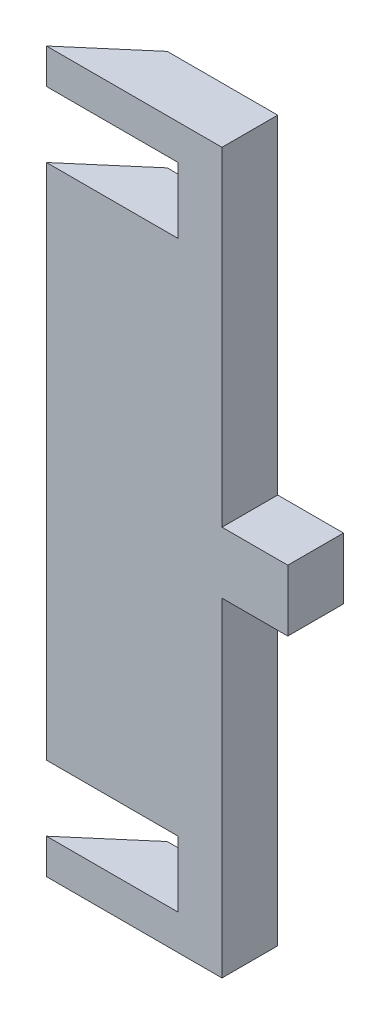
ISO-10303-21;
HEADER;
FILE_DESCRIPTION(('STEP AP214'),'2;1');
FILE_NAME('part.step','',(''),(''),'','','');
FILE_SCHEMA(('AUTOMOTIVE_DESIGN { 1 0 10303 214 1 1 1 1 }'));
ENDSEC;
DATA;
#1=APPLICATION_CONTEXT('core data for automotive mechanical design processes');
#2=APPLICATION_PROTOCOL_DEFINITION('international standard','automotive_design',2000,#1);
#3=PRODUCT_CONTEXT('',#1,'mechanical');
#4=PRODUCT('Part','Part','',(#3));
#5=PRODUCT_RELATED_PRODUCT_CATEGORY('part','',(#4));
#6=PRODUCT_DEFINITION_FORMATION('','',#4);
#7=PRODUCT_DEFINITION_CONTEXT('part definition',#1,'design');
#8=PRODUCT_DEFINITION('design','',#6,#7);
#9=PRODUCT_DEFINITION_SHAPE('','',#8);
#10=(LENGTH_UNIT() NAMED_UNIT(*) SI_UNIT(.MILLI.,.METRE.));
#11=(NAMED_UNIT(*) PLANE_ANGLE_UNIT() SI_UNIT($,.RADIAN.));
#12=(NAMED_UNIT(*) SI_UNIT($,.STERADIAN.) SOLID_ANGLE_UNIT());
#13=UNCERTAINTY_MEASURE_WITH_UNIT(LENGTH_MEASURE(1.E-05),#10,'distance_accuracy_value','');
#14=(GEOMETRIC_REPRESENTATION_CONTEXT(3) GLOBAL_UNCERTAINTY_ASSIGNED_CONTEXT((#13)) GLOBAL_UNIT_ASSIGNED_CONTEXT((#10,
#11,#12)) REPRESENTATION_CONTEXT('',''));
#15=CARTESIAN_POINT('',(0.,0.,0.));
#16=DIRECTION('',(0.,0.,1.));
#17=DIRECTION('',(1.,0.,0.));
#18=AXIS2_PLACEMENT_3D('',#15,#16,#17);
#19=CARTESIAN_POINT('',(60.,170.,0.));
#20=DIRECTION('',(0.,0.,-1.));
#21=DIRECTION('',(-1.,0.,0.));
#22=AXIS2_PLACEMENT_3D('',#19,#20,#21);
#23=PLANE('',#22);
#24=DIRECTION('',(-1.,0.,0.));
#25=VECTOR('',#24,1.);
#26=CARTESIAN_POINT('',(0.,81.,0.));
#27=LINE('',#26,#25);
#28=CARTESIAN_POINT('',(55.,81.,0.));
#29=VERTEX_POINT('',#28);
#30=CARTESIAN_POINT('',(40.,81.,0.));
#31=VERTEX_POINT('',#30);
#32=EDGE_CURVE('E237',#29,#31,#27,.T.);
#33=ORIENTED_EDGE('',*,*,#32,.F.);
#34=DIRECTION('',(0.,-1.,0.));
#35=VECTOR('',#34,1.);
#36=CARTESIAN_POINT('',(55.,95.,0.));
#37=LINE('',#36,#35);
#38=CARTESIAN_POINT('',(55.,95.,0.));
#39=VERTEX_POINT('',#38);
#40=EDGE_CURVE('E230',#39,#29,#37,.T.);
#41=ORIENTED_EDGE('',*,*,#40,.F.);
#42=DIRECTION('',(-1.,0.,0.));
#43=VECTOR('',#42,1.);
#44=CARTESIAN_POINT('',(0.,95.,0.));
#45=LINE('',#44,#43);
#46=CARTESIAN_POINT('',(40.,95.,0.));
#47=VERTEX_POINT('',#46);
#48=EDGE_CURVE('E212',#39,#47,#45,.T.);
#49=ORIENTED_EDGE('',*,*,#48,.T.);
#50=DIRECTION('',(0.,-1.,0.));
#51=VECTOR('',#50,1.);
#52=CARTESIAN_POINT('',(40.,0.,0.));
#53=LINE('',#52,#51);
#54=CARTESIAN_POINT('',(40.,170.,0.));
#55=VERTEX_POINT('',#54);
#56=EDGE_CURVE('E224',#55,#47,#53,.T.);
#57=ORIENTED_EDGE('',*,*,#56,.F.);
#58=DIRECTION('',(1.,0.,0.));
#59=VECTOR('',#58,1.);
#60=CARTESIAN_POINT('',(60.,170.,0.));
#61=LINE('',#60,#59);
#62=CARTESIAN_POINT('',(0.,170.,0.));
#63=VERTEX_POINT('',#62);
#64=EDGE_CURVE('E327',#63,#55,#61,.T.);
#65=ORIENTED_EDGE('',*,*,#64,.F.);
#66=DIRECTION('',(0.,-1.,0.));
#67=VECTOR('',#66,1.);
#68=CARTESIAN_POINT('',(0.,170.,0.));
#69=LINE('',#68,#67);
#70=CARTESIAN_POINT('',(0.,162.,0.));
#71=VERTEX_POINT('',#70);
#72=EDGE_CURVE('E336',#63,#71,#69,.T.);
#73=ORIENTED_EDGE('',*,*,#72,.T.);
#74=DIRECTION('',(1.,0.,0.));
#75=VECTOR('',#74,1.);
#76=CARTESIAN_POINT('',(0.,162.,0.));
#77=LINE('',#76,#75);
#78=CARTESIAN_POINT('',(30.,162.,0.));
#79=VERTEX_POINT('',#78);
#80=EDGE_CURVE('E252',#71,#79,#77,.T.);
#81=ORIENTED_EDGE('',*,*,#80,.T.);
#82=DIRECTION('',(0.,1.,0.));
#83=VECTOR('',#82,1.);
#84=CARTESIAN_POINT('',(30.,0.,0.));
#85=LINE('',#84,#83);
#86=CARTESIAN_POINT('',(30.,147.,0.));
#87=VERTEX_POINT('',#86);
#88=EDGE_CURVE('E245',#87,#79,#85,.T.);
#89=ORIENTED_EDGE('',*,*,#88,.F.);
#90=DIRECTION('',(1.,0.,0.));
#91=VECTOR('',#90,1.);
#92=CARTESIAN_POINT('',(0.,147.,0.));
#93=LINE('',#92,#91);
#94=CARTESIAN_POINT('',(0.,147.,0.));
#95=VERTEX_POINT('',#94);
#96=EDGE_CURVE('E249',#95,#87,#93,.T.);
#97=ORIENTED_EDGE('',*,*,#96,.F.);
#98=CARTESIAN_POINT('',(0.,29.,0.));
#99=VERTEX_POINT('',#98);
#100=EDGE_CURVE('E341',#95,#99,#69,.T.);
#101=ORIENTED_EDGE('',*,*,#100,.T.);
#102=DIRECTION('',(1.,0.,0.));
#103=VECTOR('',#102,1.);
#104=CARTESIAN_POINT('',(0.,29.,0.));
#105=LINE('',#104,#103);
#106=CARTESIAN_POINT('',(30.,29.,0.));
#107=VERTEX_POINT('',#106);
#108=EDGE_CURVE('E275',#99,#107,#105,.T.);
#109=ORIENTED_EDGE('',*,*,#108,.T.);
#110=DIRECTION('',(0.,1.,0.));
#111=VECTOR('',#110,1.);
#112=CARTESIAN_POINT('',(30.,0.,0.));
#113=LINE('',#112,#111);
#114=CARTESIAN_POINT('',(30.,14.,0.));
#115=VERTEX_POINT('',#114);
#116=EDGE_CURVE('E289',#115,#107,#113,.T.);
#117=ORIENTED_EDGE('',*,*,#116,.F.);
#118=DIRECTION('',(1.,0.,0.));
#119=VECTOR('',#118,1.);
#120=CARTESIAN_POINT('',(0.,14.,0.));
#121=LINE('',#120,#119);
#122=CARTESIAN_POINT('',(0.,14.,0.));
#123=VERTEX_POINT('',#122);
#124=EDGE_CURVE('E292',#123,#115,#121,.T.);
#125=ORIENTED_EDGE('',*,*,#124,.F.);
#126=CARTESIAN_POINT('',(0.,6.00000000000001,0.));
#127=VERTEX_POINT('',#126);
#128=EDGE_CURVE('E335',#123,#127,#69,.T.);
#129=ORIENTED_EDGE('',*,*,#128,.T.);
#130=DIRECTION('',(-1.,0.,0.));
#131=VECTOR('',#130,1.);
#132=CARTESIAN_POINT('',(0.,6.00000000000001,0.));
#133=LINE('',#132,#131);
#134=CARTESIAN_POINT('',(40.,6.00000000000001,0.));
#135=VERTEX_POINT('',#134);
#136=EDGE_CURVE('E262',#135,#127,#133,.T.);
#137=ORIENTED_EDGE('',*,*,#136,.F.);
#138=DIRECTION('',(0.,1.,0.));
#139=VECTOR('',#138,1.);
#140=CARTESIAN_POINT('',(40.,0.,0.));
#141=LINE('',#140,#139);
#142=EDGE_CURVE('E265',#135,#31,#141,.T.);
#143=ORIENTED_EDGE('',*,*,#142,.T.);
#144=EDGE_LOOP('',(#33,#41,#49,#57,#65,#73,#81,#89,#97,#101,#109,#117,#125,#129,#137,#143));
#145=FACE_BOUND('',#144,.T.);
#146=ADVANCED_FACE('F99',(#145),#23,.F.);
#147=CARTESIAN_POINT('',(0.,170.,0.));
#148=DIRECTION('',(0.650774217265847,0.,0.759271307334884));
#149=DIRECTION('',(0.759271307334884,0.,-0.650774217265847));
#150=AXIS2_PLACEMENT_3D('',#147,#148,#149);
#151=PLANE('',#150);
#152=DIRECTION('',(0.759271307334884,0.,-0.650774217265847));
#153=VECTOR('',#152,1.);
#154=CARTESIAN_POINT('',(0.,6.00000000000001,0.));
#155=LINE('',#154,#153);
#156=CARTESIAN_POINT('',(14.8173442452375,6.00000000000001,-12.7));
#157=VERTEX_POINT('',#156);
#158=EDGE_CURVE('E122',#127,#157,#155,.T.);
#159=ORIENTED_EDGE('',*,*,#158,.F.);
#160=ORIENTED_EDGE('',*,*,#128,.F.);
#161=DIRECTION('',(-0.759271307334884,0.,0.650774217265847));
#162=VECTOR('',#161,1.);
#163=CARTESIAN_POINT('',(0.,14.,0.));
#164=LINE('',#163,#162);
#165=CARTESIAN_POINT('',(14.8173442452375,14.,-12.7));
#166=VERTEX_POINT('',#165);
#167=EDGE_CURVE('E307',#166,#123,#164,.T.);
#168=ORIENTED_EDGE('',*,*,#167,.F.);
#169=DIRECTION('',(0.,-1.,0.));
#170=VECTOR('',#169,1.);
#171=CARTESIAN_POINT('',(14.8173442452375,170.,-12.7));
#172=LINE('',#171,#170);
#173=EDGE_CURVE('E322',#166,#157,#172,.T.);
#174=ORIENTED_EDGE('',*,*,#173,.T.);
#175=EDGE_LOOP('',(#159,#160,#168,#174));
#176=FACE_BOUND('',#175,.T.);
#177=ADVANCED_FACE('F420',(#176),#151,.F.);
#178=DIRECTION('',(-0.759271307334884,0.,0.650774217265847));
#179=VECTOR('',#178,1.);
#180=CARTESIAN_POINT('',(0.,147.,0.));
#181=LINE('',#180,#179);
#182=CARTESIAN_POINT('',(14.8173442452375,147.,-12.7));
#183=VERTEX_POINT('',#182);
#184=EDGE_CURVE('E310',#183,#95,#181,.T.);
#185=ORIENTED_EDGE('',*,*,#184,.F.);
#186=CARTESIAN_POINT('',(14.8173442452375,29.,-12.7));
#187=VERTEX_POINT('',#186);
#188=EDGE_CURVE('E328',#183,#187,#172,.T.);
#189=ORIENTED_EDGE('',*,*,#188,.T.);
#190=DIRECTION('',(-0.759271307334884,0.,0.650774217265847));
#191=VECTOR('',#190,1.);
#192=CARTESIAN_POINT('',(0.,29.,0.));
#193=LINE('',#192,#191);
#194=EDGE_CURVE('E300',#187,#99,#193,.T.);
#195=ORIENTED_EDGE('',*,*,#194,.T.);
#196=ORIENTED_EDGE('',*,*,#100,.F.);
#197=EDGE_LOOP('',(#185,#189,#195,#196));
#198=FACE_BOUND('',#197,.T.);
#199=ADVANCED_FACE('F409',(#198),#151,.F.);
#200=CARTESIAN_POINT('',(0.,170.,0.));
#201=DIRECTION('',(0.,1.,0.));
#202=DIRECTION('',(0.,0.,1.));
#203=AXIS2_PLACEMENT_3D('',#200,#201,#202);
#204=PLANE('',#203);
#205=ORIENTED_EDGE('',*,*,#64,.T.);
#206=DIRECTION('',(0.,0.,-1.));
#207=VECTOR('',#206,1.);
#208=CARTESIAN_POINT('',(40.,170.,0.));
#209=LINE('',#208,#207);
#210=CARTESIAN_POINT('',(40.,170.,-12.7));
#211=VERTEX_POINT('',#210);
#212=EDGE_CURVE('E223',#55,#211,#209,.T.);
#213=ORIENTED_EDGE('',*,*,#212,.T.);
#214=DIRECTION('',(-1.,0.,0.));
#215=VECTOR('',#214,1.);
#216=CARTESIAN_POINT('',(46.,170.,-12.7));
#217=LINE('',#216,#215);
#218=CARTESIAN_POINT('',(14.8173442452375,170.,-12.7));
#219=VERTEX_POINT('',#218);
#220=EDGE_CURVE('E319',#211,#219,#217,.T.);
#221=ORIENTED_EDGE('',*,*,#220,.T.);
#222=DIRECTION('',(-0.759271307334884,0.,0.650774217265847));
#223=VECTOR('',#222,1.);
#224=CARTESIAN_POINT('',(0.,170.,0.));
#225=LINE('',#224,#223);
#226=EDGE_CURVE('E332',#219,#63,#225,.T.);
#227=ORIENTED_EDGE('',*,*,#226,.T.);
#228=EDGE_LOOP('',(#205,#213,#221,#227));
#229=FACE_BOUND('',#228,.T.);
#230=ADVANCED_FACE('F388',(#229),#204,.T.);
#231=CARTESIAN_POINT('',(46.,170.,-12.7));
#232=DIRECTION('',(0.,0.,1.));
#233=DIRECTION('',(1.,0.,0.));
#234=AXIS2_PLACEMENT_3D('',#231,#232,#233);
#235=PLANE('',#234);
#236=DIRECTION('',(1.,0.,0.));
#237=VECTOR('',#236,1.);
#238=CARTESIAN_POINT('',(46.,81.,-12.7));
#239=LINE('',#238,#237);
#240=CARTESIAN_POINT('',(40.,81.,-12.7));
#241=VERTEX_POINT('',#240);
#242=CARTESIAN_POINT('',(55.,81.,-12.7));
#243=VERTEX_POINT('',#242);
#244=EDGE_CURVE('E12',#241,#243,#239,.T.);
#245=ORIENTED_EDGE('',*,*,#244,.F.);
#246=DIRECTION('',(0.,-1.,0.));
#247=VECTOR('',#246,1.);
#248=CARTESIAN_POINT('',(40.,170.,-12.7));
#249=LINE('',#248,#247);
#250=CARTESIAN_POINT('',(40.,6.00000000000001,-12.7));
#251=VERTEX_POINT('',#250);
#252=EDGE_CURVE('E107',#241,#251,#249,.T.);
#253=ORIENTED_EDGE('',*,*,#252,.T.);
#254=DIRECTION('',(1.,0.,0.));
#255=VECTOR('',#254,1.);
#256=CARTESIAN_POINT('',(46.,6.00000000000001,-12.7));
#257=LINE('',#256,#255);
#258=EDGE_CURVE('E367',#157,#251,#257,.T.);
#259=ORIENTED_EDGE('',*,*,#258,.F.);
#260=ORIENTED_EDGE('',*,*,#173,.F.);
#261=DIRECTION('',(-1.,0.,0.));
#262=VECTOR('',#261,1.);
#263=CARTESIAN_POINT('',(45.9999999999999,14.,-12.7));
#264=LINE('',#263,#262);
#265=CARTESIAN_POINT('',(30.,14.,-12.7));
#266=VERTEX_POINT('',#265);
#267=EDGE_CURVE('E348',#266,#166,#264,.T.);
#268=ORIENTED_EDGE('',*,*,#267,.F.);
#269=DIRECTION('',(0.,-1.,0.));
#270=VECTOR('',#269,1.);
#271=CARTESIAN_POINT('',(30.,170.,-12.7));
#272=LINE('',#271,#270);
#273=CARTESIAN_POINT('',(30.,29.,-12.7));
#274=VERTEX_POINT('',#273);
#275=EDGE_CURVE('E345',#274,#266,#272,.T.);
#276=ORIENTED_EDGE('',*,*,#275,.F.);
#277=DIRECTION('',(-1.,0.,0.));
#278=VECTOR('',#277,1.);
#279=CARTESIAN_POINT('',(46.,29.,-12.7));
#280=LINE('',#279,#278);
#281=EDGE_CURVE('E340',#274,#187,#280,.T.);
#282=ORIENTED_EDGE('',*,*,#281,.T.);
#283=ORIENTED_EDGE('',*,*,#188,.F.);
#284=DIRECTION('',(-1.,0.,0.));
#285=VECTOR('',#284,1.);
#286=CARTESIAN_POINT('',(46.,147.,-12.7));
#287=LINE('',#286,#285);
#288=CARTESIAN_POINT('',(30.,147.,-12.7));
#289=VERTEX_POINT('',#288);
#290=EDGE_CURVE('E351',#289,#183,#287,.T.);
#291=ORIENTED_EDGE('',*,*,#290,.F.);
#292=DIRECTION('',(0.,-1.,0.));
#293=VECTOR('',#292,1.);
#294=CARTESIAN_POINT('',(30.,170.,-12.7));
#295=LINE('',#294,#293);
#296=CARTESIAN_POINT('',(30.,162.,-12.7));
#297=VERTEX_POINT('',#296);
#298=EDGE_CURVE('E354',#297,#289,#295,.T.);
#299=ORIENTED_EDGE('',*,*,#298,.F.);
#300=DIRECTION('',(-1.,0.,0.));
#301=VECTOR('',#300,1.);
#302=CARTESIAN_POINT('',(46.,162.,-12.7));
#303=LINE('',#302,#301);
#304=CARTESIAN_POINT('',(14.8173442452375,162.,-12.7));
#305=VERTEX_POINT('',#304);
#306=EDGE_CURVE('E357',#297,#305,#303,.T.);
#307=ORIENTED_EDGE('',*,*,#306,.T.);
#308=EDGE_CURVE('E323',#219,#305,#172,.T.);
#309=ORIENTED_EDGE('',*,*,#308,.F.);
#310=ORIENTED_EDGE('',*,*,#220,.F.);
#311=DIRECTION('',(0.,1.,0.));
#312=VECTOR('',#311,1.);
#313=CARTESIAN_POINT('',(40.,170.,-12.7));
#314=LINE('',#313,#312);
#315=CARTESIAN_POINT('',(40.,95.,-12.7));
#316=VERTEX_POINT('',#315);
#317=EDGE_CURVE('E364',#316,#211,#314,.T.);
#318=ORIENTED_EDGE('',*,*,#317,.F.);
#319=DIRECTION('',(1.,0.,0.));
#320=VECTOR('',#319,1.);
#321=CARTESIAN_POINT('',(46.,95.,-12.7));
#322=LINE('',#321,#320);
#323=CARTESIAN_POINT('',(55.,95.,-12.7));
#324=VERTEX_POINT('',#323);
#325=EDGE_CURVE('E361',#316,#324,#322,.T.);
#326=ORIENTED_EDGE('',*,*,#325,.T.);
#327=DIRECTION('',(0.,-1.,0.));
#328=VECTOR('',#327,1.);
#329=CARTESIAN_POINT('',(55.,95.,-12.7));
#330=LINE('',#329,#328);
#331=EDGE_CURVE('E232',#324,#243,#330,.T.);
#332=ORIENTED_EDGE('',*,*,#331,.T.);
#333=EDGE_LOOP('',(#245,#253,#259,#260,#268,#276,#282,#283,#291,#299,#307,#309,#310,#318,#326,#332));
#334=FACE_BOUND('',#333,.T.);
#335=ADVANCED_FACE('F373',(#334),#235,.F.);
#336=ORIENTED_EDGE('',*,*,#308,.T.);
#337=DIRECTION('',(-0.759271307334884,0.,0.650774217265847));
#338=VECTOR('',#337,1.);
#339=CARTESIAN_POINT('',(0.,162.,0.));
#340=LINE('',#339,#338);
#341=EDGE_CURVE('E313',#305,#71,#340,.T.);
#342=ORIENTED_EDGE('',*,*,#341,.T.);
#343=ORIENTED_EDGE('',*,*,#72,.F.);
#344=ORIENTED_EDGE('',*,*,#226,.F.);
#345=EDGE_LOOP('',(#336,#342,#343,#344));
#346=FACE_BOUND('',#345,.T.);
#347=ADVANCED_FACE('F393',(#346),#151,.F.);
#348=CARTESIAN_POINT('',(0.,14.,0.));
#349=DIRECTION('',(0.,1.,0.));
#350=DIRECTION('',(-1.,0.,0.));
#351=AXIS2_PLACEMENT_3D('',#348,#349,#350);
#352=PLANE('',#351);
#353=ORIENTED_EDGE('',*,*,#167,.T.);
#354=ORIENTED_EDGE('',*,*,#124,.T.);
#355=DIRECTION('',(0.,0.,-1.));
#356=VECTOR('',#355,1.);
#357=CARTESIAN_POINT('',(30.,14.,0.));
#358=LINE('',#357,#356);
#359=EDGE_CURVE('E296',#115,#266,#358,.T.);
#360=ORIENTED_EDGE('',*,*,#359,.T.);
#361=ORIENTED_EDGE('',*,*,#267,.T.);
#362=EDGE_LOOP('',(#353,#354,#360,#361));
#363=FACE_BOUND('',#362,.T.);
#364=ADVANCED_FACE('F426',(#363),#352,.T.);
#365=CARTESIAN_POINT('',(30.,0.,0.));
#366=DIRECTION('',(-1.,0.,0.));
#367=DIRECTION('',(0.,0.,1.));
#368=AXIS2_PLACEMENT_3D('',#365,#366,#367);
#369=PLANE('',#368);
#370=ORIENTED_EDGE('',*,*,#275,.T.);
#371=ORIENTED_EDGE('',*,*,#359,.F.);
#372=ORIENTED_EDGE('',*,*,#116,.T.);
#373=DIRECTION('',(0.,0.,-1.));
#374=VECTOR('',#373,1.);
#375=CARTESIAN_POINT('',(30.,29.,0.));
#376=LINE('',#375,#374);
#377=EDGE_CURVE('E295',#107,#274,#376,.T.);
#378=ORIENTED_EDGE('',*,*,#377,.T.);
#379=EDGE_LOOP('',(#370,#371,#372,#378));
#380=FACE_BOUND('',#379,.T.);
#381=ADVANCED_FACE('F429',(#380),#369,.T.);
#382=CARTESIAN_POINT('',(0.,29.,0.));
#383=DIRECTION('',(0.,1.,0.));
#384=DIRECTION('',(-1.,0.,0.));
#385=AXIS2_PLACEMENT_3D('',#382,#383,#384);
#386=PLANE('',#385);
#387=ORIENTED_EDGE('',*,*,#281,.F.);
#388=ORIENTED_EDGE('',*,*,#377,.F.);
#389=ORIENTED_EDGE('',*,*,#108,.F.);
#390=ORIENTED_EDGE('',*,*,#194,.F.);
#391=EDGE_LOOP('',(#387,#388,#389,#390));
#392=FACE_BOUND('',#391,.T.);
#393=ADVANCED_FACE('F432',(#392),#386,.F.);
#394=CARTESIAN_POINT('',(30.,0.,0.));
#395=DIRECTION('',(-1.,0.,0.));
#396=DIRECTION('',(0.,0.,1.));
#397=AXIS2_PLACEMENT_3D('',#394,#395,#396);
#398=PLANE('',#397);
#399=ORIENTED_EDGE('',*,*,#298,.T.);
#400=DIRECTION('',(0.,0.,-1.));
#401=VECTOR('',#400,1.);
#402=CARTESIAN_POINT('',(30.,147.,0.));
#403=LINE('',#402,#401);
#404=EDGE_CURVE('E114',#87,#289,#403,.T.);
#405=ORIENTED_EDGE('',*,*,#404,.F.);
#406=ORIENTED_EDGE('',*,*,#88,.T.);
#407=DIRECTION('',(0.,0.,-1.));
#408=VECTOR('',#407,1.);
#409=CARTESIAN_POINT('',(30.,162.,0.));
#410=LINE('',#409,#408);
#411=EDGE_CURVE('E256',#79,#297,#410,.T.);
#412=ORIENTED_EDGE('',*,*,#411,.T.);
#413=EDGE_LOOP('',(#399,#405,#406,#412));
#414=FACE_BOUND('',#413,.T.);
#415=ADVANCED_FACE('F401',(#414),#398,.T.);
#416=CARTESIAN_POINT('',(0.,162.,0.));
#417=DIRECTION('',(0.,1.,0.));
#418=DIRECTION('',(0.,0.,1.));
#419=AXIS2_PLACEMENT_3D('',#416,#417,#418);
#420=PLANE('',#419);
#421=ORIENTED_EDGE('',*,*,#306,.F.);
#422=ORIENTED_EDGE('',*,*,#411,.F.);
#423=ORIENTED_EDGE('',*,*,#80,.F.);
#424=ORIENTED_EDGE('',*,*,#341,.F.);
#425=EDGE_LOOP('',(#421,#422,#423,#424));
#426=FACE_BOUND('',#425,.T.);
#427=ADVANCED_FACE('F398',(#426),#420,.F.);
#428=CARTESIAN_POINT('',(0.,147.,0.));
#429=DIRECTION('',(0.,1.,0.));
#430=DIRECTION('',(0.,0.,1.));
#431=AXIS2_PLACEMENT_3D('',#428,#429,#430);
#432=PLANE('',#431);
#433=ORIENTED_EDGE('',*,*,#184,.T.);
#434=ORIENTED_EDGE('',*,*,#96,.T.);
#435=ORIENTED_EDGE('',*,*,#404,.T.);
#436=ORIENTED_EDGE('',*,*,#290,.T.);
#437=EDGE_LOOP('',(#433,#434,#435,#436));
#438=FACE_BOUND('',#437,.T.);
#439=ADVANCED_FACE('F406',(#438),#432,.T.);
#440=CARTESIAN_POINT('',(40.,0.,0.));
#441=DIRECTION('',(1.,0.,0.));
#442=DIRECTION('',(0.,0.,-1.));
#443=AXIS2_PLACEMENT_3D('',#440,#441,#442);
#444=PLANE('',#443);
#445=ORIENTED_EDGE('',*,*,#317,.T.);
#446=ORIENTED_EDGE('',*,*,#212,.F.);
#447=ORIENTED_EDGE('',*,*,#56,.T.);
#448=DIRECTION('',(0.,0.,-1.));
#449=VECTOR('',#448,1.);
#450=CARTESIAN_POINT('',(40.,95.,0.));
#451=LINE('',#450,#449);
#452=EDGE_CURVE('E218',#47,#316,#451,.T.);
#453=ORIENTED_EDGE('',*,*,#452,.T.);
#454=EDGE_LOOP('',(#445,#446,#447,#453));
#455=FACE_BOUND('',#454,.T.);
#456=ADVANCED_FACE('F385',(#455),#444,.T.);
#457=CARTESIAN_POINT('',(0.,95.,0.));
#458=DIRECTION('',(0.,-1.,0.));
#459=DIRECTION('',(0.,0.,-1.));
#460=AXIS2_PLACEMENT_3D('',#457,#458,#459);
#461=PLANE('',#460);
#462=ORIENTED_EDGE('',*,*,#452,.F.);
#463=ORIENTED_EDGE('',*,*,#48,.F.);
#464=DIRECTION('',(0.,0.,-1.));
#465=VECTOR('',#464,1.);
#466=CARTESIAN_POINT('',(55.,95.,0.));
#467=LINE('',#466,#465);
#468=EDGE_CURVE('E215',#39,#324,#467,.T.);
#469=ORIENTED_EDGE('',*,*,#468,.T.);
#470=ORIENTED_EDGE('',*,*,#325,.F.);
#471=EDGE_LOOP('',(#462,#463,#469,#470));
#472=FACE_BOUND('',#471,.T.);
#473=ADVANCED_FACE('F214',(#472),#461,.F.);
#474=CARTESIAN_POINT('',(0.,81.,0.));
#475=DIRECTION('',(0.,-1.,0.));
#476=DIRECTION('',(0.,0.,-1.));
#477=AXIS2_PLACEMENT_3D('',#474,#475,#476);
#478=PLANE('',#477);
#479=ORIENTED_EDGE('',*,*,#244,.T.);
#480=DIRECTION('',(0.,0.,-1.));
#481=VECTOR('',#480,1.);
#482=CARTESIAN_POINT('',(55.,81.,0.));
#483=LINE('',#482,#481);
#484=EDGE_CURVE('E234',#29,#243,#483,.T.);
#485=ORIENTED_EDGE('',*,*,#484,.F.);
#486=ORIENTED_EDGE('',*,*,#32,.T.);
#487=DIRECTION('',(0.,0.,-1.));
#488=VECTOR('',#487,1.);
#489=CARTESIAN_POINT('',(40.,81.,0.));
#490=LINE('',#489,#488);
#491=EDGE_CURVE('E271',#31,#241,#490,.T.);
#492=ORIENTED_EDGE('',*,*,#491,.T.);
#493=EDGE_LOOP('',(#479,#485,#486,#492));
#494=FACE_BOUND('',#493,.T.);
#495=ADVANCED_FACE('F381',(#494),#478,.T.);
#496=CARTESIAN_POINT('',(40.,0.,0.));
#497=DIRECTION('',(-1.,0.,0.));
#498=DIRECTION('',(0.,0.,1.));
#499=AXIS2_PLACEMENT_3D('',#496,#497,#498);
#500=PLANE('',#499);
#501=ORIENTED_EDGE('',*,*,#491,.F.);
#502=ORIENTED_EDGE('',*,*,#142,.F.);
#503=DIRECTION('',(0.,0.,-1.));
#504=VECTOR('',#503,1.);
#505=CARTESIAN_POINT('',(40.,6.00000000000001,0.));
#506=LINE('',#505,#504);
#507=EDGE_CURVE('E270',#135,#251,#506,.T.);
#508=ORIENTED_EDGE('',*,*,#507,.T.);
#509=ORIENTED_EDGE('',*,*,#252,.F.);
#510=EDGE_LOOP('',(#501,#502,#508,#509));
#511=FACE_BOUND('',#510,.T.);
#512=ADVANCED_FACE('F378',(#511),#500,.F.);
#513=CARTESIAN_POINT('',(0.,6.00000000000001,0.));
#514=DIRECTION('',(0.,-1.,0.));
#515=DIRECTION('',(0.,0.,-1.));
#516=AXIS2_PLACEMENT_3D('',#513,#514,#515);
#517=PLANE('',#516);
#518=ORIENTED_EDGE('',*,*,#158,.T.);
#519=ORIENTED_EDGE('',*,*,#258,.T.);
#520=ORIENTED_EDGE('',*,*,#507,.F.);
#521=ORIENTED_EDGE('',*,*,#136,.T.);
#522=EDGE_LOOP('',(#518,#519,#520,#521));
#523=FACE_BOUND('',#522,.T.);
#524=ADVANCED_FACE('F547',(#523),#517,.T.);
#525=CARTESIAN_POINT('',(55.,95.,0.));
#526=DIRECTION('',(1.,0.,0.));
#527=DIRECTION('',(0.,0.,-1.));
#528=AXIS2_PLACEMENT_3D('',#525,#526,#527);
#529=PLANE('',#528);
#530=ORIENTED_EDGE('',*,*,#331,.F.);
#531=ORIENTED_EDGE('',*,*,#468,.F.);
#532=ORIENTED_EDGE('',*,*,#40,.T.);
#533=ORIENTED_EDGE('',*,*,#484,.T.);
#534=EDGE_LOOP('',(#530,#531,#532,#533));
#535=FACE_BOUND('',#534,.T.);
#536=ADVANCED_FACE('F228',(#535),#529,.T.);
#537=CLOSED_SHELL('',(#146,#177,#199,#230,#335,#347,#364,#381,#393,#415,#427,#439,#456,#473,
#495,#512,#524,#536));
#538=MANIFOLD_SOLID_BREP('B2',#537);
#539=ADVANCED_BREP_SHAPE_REPRESENTATION('',(#18,#538),#14);
#540=SHAPE_DEFINITION_REPRESENTATION(#9,#539);
ENDSEC;
END-ISO-10303-21;
